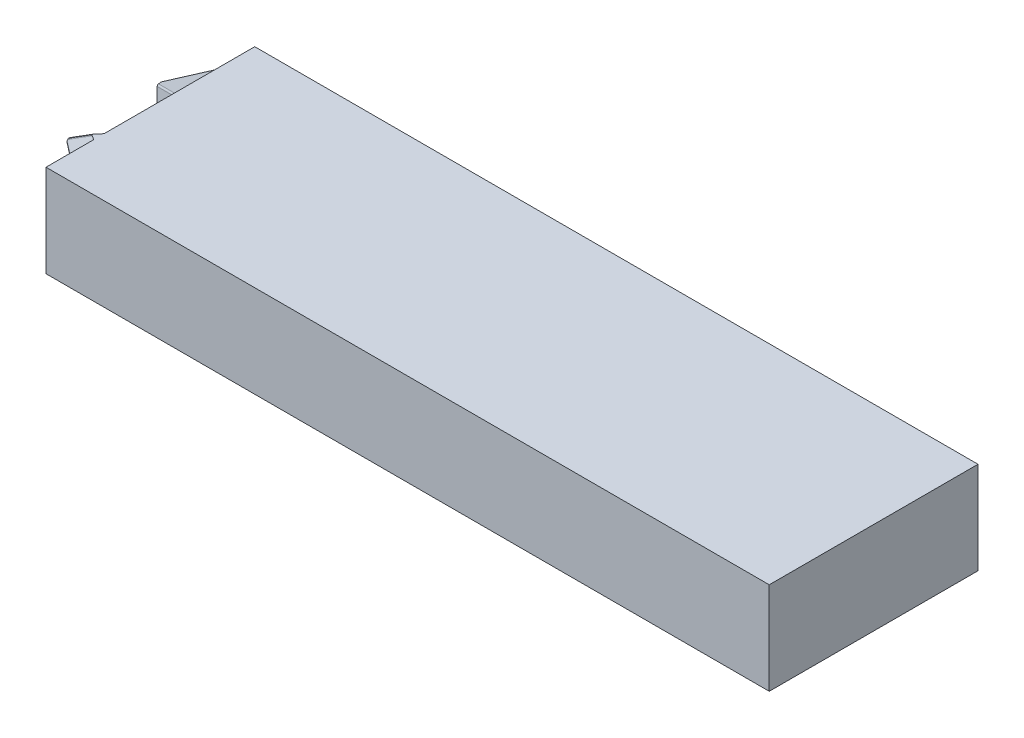
ISO-10303-21;
HEADER;
FILE_DESCRIPTION(('STEP AP214'),'2;1');
FILE_NAME('part.step','',(''),(''),'','','');
FILE_SCHEMA(('AUTOMOTIVE_DESIGN { 1 0 10303 214 1 1 1 1 }'));
ENDSEC;
DATA;
#1=APPLICATION_CONTEXT('core data for automotive mechanical design processes');
#2=APPLICATION_PROTOCOL_DEFINITION('international standard','automotive_design',2000,#1);
#3=PRODUCT_CONTEXT('',#1,'mechanical');
#4=PRODUCT('Part','Part','',(#3));
#5=PRODUCT_RELATED_PRODUCT_CATEGORY('part','',(#4));
#6=PRODUCT_DEFINITION_FORMATION('','',#4);
#7=PRODUCT_DEFINITION_CONTEXT('part definition',#1,'design');
#8=PRODUCT_DEFINITION('design','',#6,#7);
#9=PRODUCT_DEFINITION_SHAPE('','',#8);
#10=(LENGTH_UNIT() NAMED_UNIT(*) SI_UNIT(.MILLI.,.METRE.));
#11=(NAMED_UNIT(*) PLANE_ANGLE_UNIT() SI_UNIT($,.RADIAN.));
#12=(NAMED_UNIT(*) SI_UNIT($,.STERADIAN.) SOLID_ANGLE_UNIT());
#13=UNCERTAINTY_MEASURE_WITH_UNIT(LENGTH_MEASURE(1.E-05),#10,'distance_accuracy_value','');
#14=(GEOMETRIC_REPRESENTATION_CONTEXT(3) GLOBAL_UNCERTAINTY_ASSIGNED_CONTEXT((#13)) GLOBAL_UNIT_ASSIGNED_CONTEXT((#10,
#11,#12)) REPRESENTATION_CONTEXT('',''));
#15=CARTESIAN_POINT('',(0.,0.,0.));
#16=DIRECTION('',(0.,0.,1.));
#17=DIRECTION('',(1.,0.,0.));
#18=AXIS2_PLACEMENT_3D('',#15,#16,#17);
#19=CARTESIAN_POINT('',(-11.,2.8067,-3.175));
#20=DIRECTION('',(1.,0.,0.));
#21=DIRECTION('',(0.,0.,-1.));
#22=AXIS2_PLACEMENT_3D('',#19,#20,#21);
#23=PLANE('',#22);
#24=DIRECTION('',(0.,-0.87607248437468,0.482179429384514));
#25=VECTOR('',#24,1.);
#26=CARTESIAN_POINT('',(-11.,2.2745196464413,2.01462656238576));
#27=LINE('',#26,#25);
#28=CARTESIAN_POINT('',(-11.,2.8067,1.72172109647361));
#29=VERTEX_POINT('',#28);
#30=CARTESIAN_POINT('',(-11.,1.86321507108885,2.24100349920765));
#31=VERTEX_POINT('',#30);
#32=EDGE_CURVE('E237',#29,#31,#27,.T.);
#33=ORIENTED_EDGE('',*,*,#32,.T.);
#34=CARTESIAN_POINT('',(-11.,1.84729757885279,2.18563022142526));
#35=DIRECTION('',(1.,0.,0.));
#36=DIRECTION('',(0.,0.292680628640583,-0.956210253876496));
#37=AXIS2_PLACEMENT_3D('',#34,#35,#36);
#38=ELLIPSE('',#37,0.062410100244307,0.049609375);
#39=CARTESIAN_POINT('',(-11.,1.8031131352836,2.2226072602187));
#40=VERTEX_POINT('',#39);
#41=EDGE_CURVE('E229',#31,#40,#38,.T.);
#42=ORIENTED_EDGE('',*,*,#41,.T.);
#43=DIRECTION('',(0.,-0.456090790910399,-0.889933250556876));
#44=VECTOR('',#43,1.);
#45=CARTESIAN_POINT('',(-11.,0.0120613961511823,-1.27212784052748));
#46=LINE('',#45,#44);
#47=CARTESIAN_POINT('',(-11.,0.,-1.29566227204198));
#48=VERTEX_POINT('',#47);
#49=EDGE_CURVE('E193',#40,#48,#46,.T.);
#50=ORIENTED_EDGE('',*,*,#49,.T.);
#51=DIRECTION('',(0.,0.,1.));
#52=VECTOR('',#51,1.);
#53=CARTESIAN_POINT('',(-11.,0.,-3.175));
#54=LINE('',#53,#52);
#55=CARTESIAN_POINT('',(-11.,0.,3.175));
#56=VERTEX_POINT('',#55);
#57=EDGE_CURVE('E393',#48,#56,#54,.T.);
#58=ORIENTED_EDGE('',*,*,#57,.T.);
#59=DIRECTION('',(0.,-1.,0.));
#60=VECTOR('',#59,1.);
#61=CARTESIAN_POINT('',(-11.,2.8067,3.175));
#62=LINE('',#61,#60);
#63=CARTESIAN_POINT('',(-11.,2.8067,3.175));
#64=VERTEX_POINT('',#63);
#65=EDGE_CURVE('E400',#64,#56,#62,.T.);
#66=ORIENTED_EDGE('',*,*,#65,.F.);
#67=DIRECTION('',(0.,0.,1.));
#68=VECTOR('',#67,1.);
#69=CARTESIAN_POINT('',(-11.,2.8067,-3.175));
#70=LINE('',#69,#68);
#71=EDGE_CURVE('E382',#29,#64,#70,.T.);
#72=ORIENTED_EDGE('',*,*,#71,.F.);
#73=EDGE_LOOP('',(#33,#42,#50,#58,#66,#72));
#74=FACE_BOUND('',#73,.T.);
#75=ADVANCED_FACE('F39',(#74),#23,.F.);
#76=DIRECTION('',(0.,-1.,0.));
#77=VECTOR('',#76,1.);
#78=CARTESIAN_POINT('',(-11.,0.912218846153847,-0.692687520153666));
#79=LINE('',#78,#77);
#80=CARTESIAN_POINT('',(-11.,2.75866154006839,-0.692687520153666));
#81=VERTEX_POINT('',#80);
#82=CARTESIAN_POINT('',(-11.,1.80145727445214,-0.692687520153666));
#83=VERTEX_POINT('',#82);
#84=EDGE_CURVE('E409',#81,#83,#79,.T.);
#85=ORIENTED_EDGE('',*,*,#84,.T.);
#86=CARTESIAN_POINT('',(-11.,1.82172140136658,-0.636501427795264));
#87=DIRECTION('',(1.,0.,0.));
#88=DIRECTION('',(0.,-0.853282189545148,-0.521449427082855));
#89=AXIS2_PLACEMENT_3D('',#86,#87,#88);
#90=ELLIPSE('',#89,0.0708518275062262,0.049609375);
#91=CARTESIAN_POINT('',(-11.,1.76247801772125,-0.62890318402688));
#92=VERTEX_POINT('',#91);
#93=EDGE_CURVE('E224',#83,#92,#90,.F.);
#94=ORIENTED_EDGE('',*,*,#93,.T.);
#95=DIRECTION('',(0.,0.456180989989925,0.889887017756643));
#96=VECTOR('',#95,1.);
#97=CARTESIAN_POINT('',(-11.,2.7107906973169,1.22100104447861));
#98=LINE('',#97,#96);
#99=CARTESIAN_POINT('',(-11.,2.8067,1.40809442454617));
#100=VERTEX_POINT('',#99);
#101=EDGE_CURVE('E411',#92,#100,#98,.T.);
#102=ORIENTED_EDGE('',*,*,#101,.T.);
#103=CARTESIAN_POINT('',(-11.,2.8067,-3.175));
#104=VERTEX_POINT('',#103);
#105=EDGE_CURVE('E383',#104,#100,#70,.T.);
#106=ORIENTED_EDGE('',*,*,#105,.F.);
#107=DIRECTION('',(0.,-1.,0.));
#108=VECTOR('',#107,1.);
#109=CARTESIAN_POINT('',(-11.,2.8067,-3.175));
#110=LINE('',#109,#108);
#111=CARTESIAN_POINT('',(-11.,0.,-3.175));
#112=VERTEX_POINT('',#111);
#113=EDGE_CURVE('E403',#104,#112,#110,.T.);
#114=ORIENTED_EDGE('',*,*,#113,.T.);
#115=CARTESIAN_POINT('',(-11.,0.,-1.99962017215403));
#116=VERTEX_POINT('',#115);
#117=EDGE_CURVE('E394',#112,#116,#54,.T.);
#118=ORIENTED_EDGE('',*,*,#117,.T.);
#119=DIRECTION('',(0.,1.,0.));
#120=VECTOR('',#119,1.);
#121=CARTESIAN_POINT('',(-11.,2.30284384615385,-1.99962017215403));
#122=LINE('',#121,#120);
#123=CARTESIAN_POINT('',(-11.,2.75866154006839,-1.99962017215403));
#124=VERTEX_POINT('',#123);
#125=EDGE_CURVE('E415',#116,#124,#122,.T.);
#126=ORIENTED_EDGE('',*,*,#125,.T.);
#127=CARTESIAN_POINT('',(-11.,2.74627792594947,-1.94343407979562));
#128=DIRECTION('',(1.,0.,0.));
#129=DIRECTION('',(0.,-0.707106781186548,0.707106781186547));
#130=AXIS2_PLACEMENT_3D('',#127,#128,#129);
#131=ELLIPSE('',#130,0.0620698305227514,0.049609375);
#132=CARTESIAN_POINT('',(-11.,2.80246401830787,-1.95581769391454));
#133=VERTEX_POINT('',#132);
#134=EDGE_CURVE('E197',#124,#133,#131,.T.);
#135=ORIENTED_EDGE('',*,*,#134,.T.);
#136=DIRECTION('',(0.,0.,1.));
#137=VECTOR('',#136,1.);
#138=CARTESIAN_POINT('',(-11.,2.80246401830787,-1.19230769230769));
#139=LINE('',#138,#137);
#140=CARTESIAN_POINT('',(-11.,2.80246401830787,-0.736489998393152));
#141=VERTEX_POINT('',#140);
#142=EDGE_CURVE('E413',#133,#141,#139,.T.);
#143=ORIENTED_EDGE('',*,*,#142,.T.);
#144=CARTESIAN_POINT('',(-11.,2.74627792594947,-0.748873612512068));
#145=DIRECTION('',(1.,0.,0.));
#146=DIRECTION('',(0.,0.707106781186548,0.707106781186547));
#147=AXIS2_PLACEMENT_3D('',#144,#145,#146);
#148=ELLIPSE('',#147,0.0620698305227514,0.049609375);
#149=EDGE_CURVE('E53',#141,#81,#148,.T.);
#150=ORIENTED_EDGE('',*,*,#149,.T.);
#151=EDGE_LOOP('',(#85,#94,#102,#106,#114,#118,#126,#135,#143,#150));
#152=FACE_BOUND('',#151,.T.);
#153=ADVANCED_FACE('F316',(#152),#23,.F.);
#154=CARTESIAN_POINT('',(11.,2.8067,-3.175));
#155=DIRECTION('',(-1.,0.,0.));
#156=DIRECTION('',(0.,0.,1.));
#157=AXIS2_PLACEMENT_3D('',#154,#155,#156);
#158=PLANE('',#157);
#159=DIRECTION('',(0.,0.,-1.));
#160=VECTOR('',#159,1.);
#161=CARTESIAN_POINT('',(11.,0.,-3.175));
#162=LINE('',#161,#160);
#163=CARTESIAN_POINT('',(11.,0.,3.175));
#164=VERTEX_POINT('',#163);
#165=CARTESIAN_POINT('',(11.,0.,-3.175));
#166=VERTEX_POINT('',#165);
#167=EDGE_CURVE('E181',#164,#166,#162,.T.);
#168=ORIENTED_EDGE('',*,*,#167,.T.);
#169=DIRECTION('',(0.,-1.,0.));
#170=VECTOR('',#169,1.);
#171=CARTESIAN_POINT('',(11.,2.8067,-3.175));
#172=LINE('',#171,#170);
#173=CARTESIAN_POINT('',(11.,2.8067,-3.175));
#174=VERTEX_POINT('',#173);
#175=EDGE_CURVE('E406',#174,#166,#172,.T.);
#176=ORIENTED_EDGE('',*,*,#175,.F.);
#177=DIRECTION('',(0.,0.,-1.));
#178=VECTOR('',#177,1.);
#179=CARTESIAN_POINT('',(11.,2.8067,-3.175));
#180=LINE('',#179,#178);
#181=CARTESIAN_POINT('',(11.,2.8067,3.175));
#182=VERTEX_POINT('',#181);
#183=EDGE_CURVE('E376',#182,#174,#180,.T.);
#184=ORIENTED_EDGE('',*,*,#183,.F.);
#185=DIRECTION('',(0.,-1.,0.));
#186=VECTOR('',#185,1.);
#187=CARTESIAN_POINT('',(11.,2.8067,3.175));
#188=LINE('',#187,#186);
#189=EDGE_CURVE('E388',#182,#164,#188,.T.);
#190=ORIENTED_EDGE('',*,*,#189,.T.);
#191=EDGE_LOOP('',(#168,#176,#184,#190));
#192=FACE_BOUND('',#191,.T.);
#193=ADVANCED_FACE('F321',(#192),#158,.F.);
#194=CARTESIAN_POINT('',(11.,2.8067,-3.175));
#195=DIRECTION('',(0.,0.,1.));
#196=DIRECTION('',(1.,0.,0.));
#197=AXIS2_PLACEMENT_3D('',#194,#195,#196);
#198=PLANE('',#197);
#199=DIRECTION('',(-1.,0.,0.));
#200=VECTOR('',#199,1.);
#201=CARTESIAN_POINT('',(11.,0.,-3.175));
#202=LINE('',#201,#200);
#203=EDGE_CURVE('E391',#166,#112,#202,.T.);
#204=ORIENTED_EDGE('',*,*,#203,.T.);
#205=ORIENTED_EDGE('',*,*,#113,.F.);
#206=DIRECTION('',(-1.,0.,0.));
#207=VECTOR('',#206,1.);
#208=CARTESIAN_POINT('',(11.,2.8067,-3.175));
#209=LINE('',#208,#207);
#210=EDGE_CURVE('E379',#174,#104,#209,.T.);
#211=ORIENTED_EDGE('',*,*,#210,.F.);
#212=ORIENTED_EDGE('',*,*,#175,.T.);
#213=EDGE_LOOP('',(#204,#205,#211,#212));
#214=FACE_BOUND('',#213,.T.);
#215=ADVANCED_FACE('F325',(#214),#198,.F.);
#216=CARTESIAN_POINT('',(11.,2.8067,3.175));
#217=DIRECTION('',(0.,0.,-1.));
#218=DIRECTION('',(-1.,0.,0.));
#219=AXIS2_PLACEMENT_3D('',#216,#217,#218);
#220=PLANE('',#219);
#221=DIRECTION('',(1.,0.,0.));
#222=VECTOR('',#221,1.);
#223=CARTESIAN_POINT('',(11.,0.,3.175));
#224=LINE('',#223,#222);
#225=EDGE_CURVE('E380',#56,#164,#224,.T.);
#226=ORIENTED_EDGE('',*,*,#225,.T.);
#227=ORIENTED_EDGE('',*,*,#189,.F.);
#228=DIRECTION('',(1.,0.,0.));
#229=VECTOR('',#228,1.);
#230=CARTESIAN_POINT('',(11.,2.8067,3.175));
#231=LINE('',#230,#229);
#232=EDGE_CURVE('E386',#64,#182,#231,.T.);
#233=ORIENTED_EDGE('',*,*,#232,.F.);
#234=ORIENTED_EDGE('',*,*,#65,.T.);
#235=EDGE_LOOP('',(#226,#227,#233,#234));
#236=FACE_BOUND('',#235,.T.);
#237=ADVANCED_FACE('F324',(#236),#220,.F.);
#238=CARTESIAN_POINT('',(0.,2.8067,0.));
#239=DIRECTION('',(0.,-1.,0.));
#240=DIRECTION('',(0.,0.,-1.));
#241=AXIS2_PLACEMENT_3D('',#238,#239,#240);
#242=PLANE('',#241);
#243=DIRECTION('',(-0.651145165888793,0.,0.758953208662863));
#244=VECTOR('',#243,1.);
#245=CARTESIAN_POINT('',(-5.64024533094836,2.8067,-4.83905784935588));
#246=LINE('',#245,#244);
#247=CARTESIAN_POINT('',(-11.149563435863,2.8067,1.58242060477962));
#248=VERTEX_POINT('',#247);
#249=EDGE_CURVE('E422',#100,#248,#246,.T.);
#250=ORIENTED_EDGE('',*,*,#249,.T.);
#251=CARTESIAN_POINT('',(-11.071270536977,2.8067,1.61433122777363));
#252=DIRECTION('',(0.,-1.,0.));
#253=DIRECTION('',(0.977280791027944,0.,0.211948709568604));
#254=AXIS2_PLACEMENT_3D('',#251,#252,#253);
#255=ELLIPSE('',#254,0.0871317741458214,0.049609375);
#256=CARTESIAN_POINT('',(-11.1243635835041,2.8067,1.64624185076764));
#257=VERTEX_POINT('',#256);
#258=EDGE_CURVE('E218',#248,#257,#255,.F.);
#259=ORIENTED_EDGE('',*,*,#258,.T.);
#260=DIRECTION('',(0.854870495857655,0.,0.518841435616015));
#261=VECTOR('',#260,1.);
#262=CARTESIAN_POINT('',(-3.72481681218898,2.8067,6.13720450340346));
#263=LINE('',#262,#261);
#264=EDGE_CURVE('E420',#257,#29,#263,.T.);
#265=ORIENTED_EDGE('',*,*,#264,.T.);
#266=ORIENTED_EDGE('',*,*,#71,.T.);
#267=ORIENTED_EDGE('',*,*,#232,.T.);
#268=ORIENTED_EDGE('',*,*,#183,.T.);
#269=ORIENTED_EDGE('',*,*,#210,.T.);
#270=ORIENTED_EDGE('',*,*,#105,.T.);
#271=EDGE_LOOP('',(#250,#259,#265,#266,#267,#268,#269,#270));
#272=FACE_BOUND('',#271,.T.);
#273=ADVANCED_FACE('F270',(#272),#242,.F.);
#274=CARTESIAN_POINT('',(0.,0.,0.));
#275=DIRECTION('',(0.,-1.,0.));
#276=DIRECTION('',(0.,0.,-1.));
#277=AXIS2_PLACEMENT_3D('',#274,#275,#276);
#278=PLANE('',#277);
#279=DIRECTION('',(-0.651070996045853,0.,-0.759016836511458));
#280=VECTOR('',#279,1.);
#281=CARTESIAN_POINT('',(-11.5766568640276,0.,-1.96792731125442));
#282=LINE('',#281,#280);
#283=CARTESIAN_POINT('',(-11.3771281063133,0.,-1.73531721589903));
#284=VERTEX_POINT('',#283);
#285=EDGE_CURVE('E246',#48,#284,#282,.T.);
#286=ORIENTED_EDGE('',*,*,#285,.T.);
#287=CARTESIAN_POINT('',(-11.3090304137424,0.,-1.77911969413852));
#288=DIRECTION('',(0.,-1.,0.));
#289=DIRECTION('',(-0.882947592858924,0.,0.469471562785897));
#290=AXIS2_PLACEMENT_3D('',#287,#288,#289);
#291=ELLIPSE('',#290,0.081438040258606,0.049609375);
#292=CARTESIAN_POINT('',(-11.3323206045525,0.,-1.822922172378));
#293=VERTEX_POINT('',#292);
#294=EDGE_CURVE('E226',#284,#293,#291,.T.);
#295=ORIENTED_EDGE('',*,*,#294,.T.);
#296=DIRECTION('',(0.882947592858924,0.,-0.469471562785897));
#297=VECTOR('',#296,1.);
#298=CARTESIAN_POINT('',(-12.0819380176308,0.,-1.42434352370659));
#299=LINE('',#298,#297);
#300=EDGE_CURVE('E192',#293,#116,#299,.T.);
#301=ORIENTED_EDGE('',*,*,#300,.T.);
#302=ORIENTED_EDGE('',*,*,#117,.F.);
#303=ORIENTED_EDGE('',*,*,#203,.F.);
#304=ORIENTED_EDGE('',*,*,#167,.F.);
#305=ORIENTED_EDGE('',*,*,#225,.F.);
#306=ORIENTED_EDGE('',*,*,#57,.F.);
#307=EDGE_LOOP('',(#286,#295,#301,#302,#303,#304,#305,#306));
#308=FACE_BOUND('',#307,.T.);
#309=ADVANCED_FACE('F367',(#308),#278,.T.);
#310=CARTESIAN_POINT('',(-12.0819380176308,1.99713308035468,1.51064251977768));
#311=DIRECTION('',(0.469471562785897,-0.425739166501146,-0.773526091248561));
#312=DIRECTION('',(0.,0.87607248437468,-0.482179429384514));
#313=AXIS2_PLACEMENT_3D('',#310,#311,#312);
#314=PLANE('',#313);
#315=DIRECTION('',(0.803410896396009,0.569360322182526,0.174240509286364));
#316=VECTOR('',#315,1.);
#317=CARTESIAN_POINT('',(-12.1317507958088,2.09278597377346,1.42776378218787));
#318=LINE('',#317,#316);
#319=CARTESIAN_POINT('',(-12.0722490634188,2.13495359394886,1.44066827751096));
#320=VERTEX_POINT('',#319);
#321=EDGE_CURVE('E208',#257,#320,#318,.F.);
#322=ORIENTED_EDGE('',*,*,#321,.T.);
#323=CARTESIAN_POINT('',(-18.260598763273,-2.10240745888857,0.0170011842921174));
#324=DIRECTION('',(0.469471562785897,-0.425739166501146,-0.773526091248561));
#325=DIRECTION('',(-0.22089112034542,-0.90484593280122,0.363951852372859));
#326=AXIS2_PLACEMENT_3D('',#323,#324,#325);
#327=ELLIPSE('',#326,14.9152356645648,6.35);
#328=CARTESIAN_POINT('',(-12.0757559167848,2.10354509068977,1.45582673460892));
#329=VERTEX_POINT('',#328);
#330=EDGE_CURVE('E252',#320,#329,#327,.T.);
#331=ORIENTED_EDGE('',*,*,#330,.T.);
#332=DIRECTION('',(-0.794893371518424,0.177583721899131,-0.580179756310512));
#333=VECTOR('',#332,1.);
#334=CARTESIAN_POINT('',(-12.0393609775663,2.09541425327648,1.48239080939345));
#335=LINE('',#334,#333);
#336=EDGE_CURVE('E211',#329,#31,#335,.F.);
#337=ORIENTED_EDGE('',*,*,#336,.T.);
#338=ORIENTED_EDGE('',*,*,#32,.F.);
#339=ORIENTED_EDGE('',*,*,#264,.F.);
#340=EDGE_LOOP('',(#322,#331,#337,#338,#339));
#341=FACE_BOUND('',#340,.T.);
#342=ADVANCED_FACE('F362',(#341),#314,.F.);
#343=CARTESIAN_POINT('',(-12.0819380176308,2.19885947624498,1.48343131548544));
#344=DIRECTION('',(0.469471562785896,-0.785723600244635,0.402783907019605));
#345=DIRECTION('',(0.,-0.456180989989925,-0.889887017756643));
#346=AXIS2_PLACEMENT_3D('',#343,#344,#345);
#347=PLANE('',#346);
#348=DIRECTION('',(0.700184832856153,0.609210737355738,0.372294879535939));
#349=VECTOR('',#348,1.);
#350=CARTESIAN_POINT('',(-12.1075345037534,0.798844017072797,-1.2177897255631));
#351=LINE('',#350,#349);
#352=CARTESIAN_POINT('',(-12.0230771623647,0.872327927046444,-1.17288296057368));
#353=VERTEX_POINT('',#352);
#354=EDGE_CURVE('E213',#92,#353,#351,.F.);
#355=ORIENTED_EDGE('',*,*,#354,.T.);
#356=CARTESIAN_POINT('',(-18.260598763273,-2.24463690429748,0.0170011842921174));
#357=DIRECTION('',(0.469471562785896,-0.785723600244635,0.402783907019605));
#358=DIRECTION('',(-0.596327447527803,-0.618577742905942,-0.511620124024033));
#359=AXIS2_PLACEMENT_3D('',#356,#357,#358);
#360=ELLIPSE('',#359,8.08172237415668,6.35);
#361=CARTESIAN_POINT('',(-12.0597122264441,2.16169678811444,1.38503121224262));
#362=VERTEX_POINT('',#361);
#363=EDGE_CURVE('E443',#353,#362,#360,.T.);
#364=ORIENTED_EDGE('',*,*,#363,.T.);
#365=DIRECTION('',(0.803410896396009,0.569360322182526,0.174240509286364));
#366=VECTOR('',#365,1.);
#367=CARTESIAN_POINT('',(-12.0432842400164,2.17333895489016,1.38859404756705));
#368=LINE('',#367,#366);
#369=EDGE_CURVE('E216',#362,#248,#368,.T.);
#370=ORIENTED_EDGE('',*,*,#369,.T.);
#371=ORIENTED_EDGE('',*,*,#249,.F.);
#372=ORIENTED_EDGE('',*,*,#101,.F.);
#373=EDGE_LOOP('',(#355,#364,#370,#371,#372));
#374=FACE_BOUND('',#373,.T.);
#375=ADVANCED_FACE('F356',(#374),#347,.F.);
#376=CARTESIAN_POINT('',(-12.0819380176308,0.524019213873469,-1.53450622211015));
#377=DIRECTION('',(0.469471562785897,0.785764421384311,-0.402704265959459));
#378=DIRECTION('',(0.,0.456090790910398,0.889933250556876));
#379=AXIS2_PLACEMENT_3D('',#376,#377,#378);
#380=PLANE('',#379);
#381=DIRECTION('',(-0.794893371518424,0.177583721899131,-0.580179756310512));
#382=VECTOR('',#381,1.);
#383=CARTESIAN_POINT('',(-13.2357809139477,2.30259936862763,0.590747098471428));
#384=LINE('',#383,#382);
#385=CARTESIAN_POINT('',(-12.0721154986172,2.0426298646614,1.4400875776904));
#386=VERTEX_POINT('',#385);
#387=EDGE_CURVE('E200',#40,#386,#384,.T.);
#388=ORIENTED_EDGE('',*,*,#387,.T.);
#389=CARTESIAN_POINT('',(-18.260598763273,5.01073822463675,0.0170011842921174));
#390=DIRECTION('',(0.469471562785897,0.785764421384311,-0.402704265959459));
#391=DIRECTION('',(0.596408425362376,-0.618525887967981,-0.511588424488077));
#392=AXIS2_PLACEMENT_3D('',#389,#390,#391);
#393=ELLIPSE('',#392,8.08130252170615,6.35);
#394=CARTESIAN_POINT('',(-12.0639559116625,0.597521111537213,-1.37012439386751));
#395=VERTEX_POINT('',#394);
#396=EDGE_CURVE('E253',#386,#395,#393,.T.);
#397=ORIENTED_EDGE('',*,*,#396,.T.);
#398=DIRECTION('',(-0.700214429036765,0.609167102283721,0.372310616104311));
#399=VECTOR('',#398,1.);
#400=CARTESIAN_POINT('',(-11.9985665918809,0.540634219751169,-1.4048925119253));
#401=LINE('',#400,#399);
#402=EDGE_CURVE('E198',#395,#284,#401,.F.);
#403=ORIENTED_EDGE('',*,*,#402,.T.);
#404=ORIENTED_EDGE('',*,*,#285,.F.);
#405=ORIENTED_EDGE('',*,*,#49,.F.);
#406=EDGE_LOOP('',(#388,#397,#403,#404,#405));
#407=FACE_BOUND('',#406,.T.);
#408=ADVANCED_FACE('F243',(#407),#380,.F.);
#409=CARTESIAN_POINT('',(-12.0819380176308,0.912218846153847,-1.2679641686011));
#410=DIRECTION('',(0.469471562785897,0.,-0.882947592858924));
#411=DIRECTION('',(0.,1.,0.));
#412=AXIS2_PLACEMENT_3D('',#409,#410,#411);
#413=PLANE('',#412);
#414=DIRECTION('',(0.799251014255886,0.424969302544865,0.424969302544865));
#415=VECTOR('',#414,1.);
#416=CARTESIAN_POINT('',(-12.5136986488363,1.95381369178885,-1.4975353684332));
#417=LINE('',#416,#415);
#418=CARTESIAN_POINT('',(-12.0370884748072,2.20723181654596,-1.2441172436761));
#419=VERTEX_POINT('',#418);
#420=EDGE_CURVE('E220',#81,#419,#417,.F.);
#421=ORIENTED_EDGE('',*,*,#420,.T.);
#422=DIRECTION('',(0.,-1.,0.));
#423=VECTOR('',#422,1.);
#424=CARTESIAN_POINT('',(-12.0370884748072,2.8067,-1.2441172436761));
#425=LINE('',#424,#423);
#426=CARTESIAN_POINT('',(-12.0370884748072,0.899116342753824,-1.2441172436761));
#427=VERTEX_POINT('',#426);
#428=EDGE_CURVE('E298',#419,#427,#425,.T.);
#429=ORIENTED_EDGE('',*,*,#428,.T.);
#430=DIRECTION('',(0.700184832856153,0.609210737355738,0.372294879535939));
#431=VECTOR('',#430,1.);
#432=CARTESIAN_POINT('',(-11.0305745037534,1.77485527580566,-0.708944272167742));
#433=LINE('',#432,#431);
#434=EDGE_CURVE('E60',#427,#83,#433,.T.);
#435=ORIENTED_EDGE('',*,*,#434,.T.);
#436=ORIENTED_EDGE('',*,*,#84,.F.);
#437=EDGE_LOOP('',(#421,#429,#435,#436));
#438=FACE_BOUND('',#437,.T.);
#439=ADVANCED_FACE('F345',(#438),#413,.F.);
#440=CARTESIAN_POINT('',(-12.0819380176308,2.30284384615385,-1.42434352370659));
#441=DIRECTION('',(0.469471562785897,0.,0.882947592858924));
#442=DIRECTION('',(0.,-1.,0.));
#443=AXIS2_PLACEMENT_3D('',#440,#441,#442);
#444=PLANE('',#443);
#445=DIRECTION('',(0.,-1.,0.));
#446=VECTOR('',#445,1.);
#447=CARTESIAN_POINT('',(-12.07696,2.30284384615385,-1.42699038263188));
#448=LINE('',#447,#446);
#449=CARTESIAN_POINT('',(-12.07696,2.18603175054624,-1.42699038263188));
#450=VERTEX_POINT('',#449);
#451=CARTESIAN_POINT('',(-12.07696,0.64781558899754,-1.42699038263188));
#452=VERTEX_POINT('',#451);
#453=EDGE_CURVE('E173',#450,#452,#448,.T.);
#454=ORIENTED_EDGE('',*,*,#453,.F.);
#455=DIRECTION('',(-0.799251014255886,-0.424969302544865,0.424969302544865));
#456=VECTOR('',#455,1.);
#457=CARTESIAN_POINT('',(-12.0413629300597,2.20495904837302,-1.44591768045866));
#458=LINE('',#457,#456);
#459=EDGE_CURVE('E187',#450,#124,#458,.F.);
#460=ORIENTED_EDGE('',*,*,#459,.T.);
#461=ORIENTED_EDGE('',*,*,#125,.F.);
#462=ORIENTED_EDGE('',*,*,#300,.F.);
#463=DIRECTION('',(-0.700214429036765,0.609167102283721,0.372310616104311));
#464=VECTOR('',#463,1.);
#465=CARTESIAN_POINT('',(-12.7860390744291,1.26469468652512,-1.04996635096414));
#466=LINE('',#465,#464);
#467=EDGE_CURVE('E191',#293,#452,#466,.T.);
#468=ORIENTED_EDGE('',*,*,#467,.T.);
#469=EDGE_LOOP('',(#454,#460,#461,#462,#468));
#470=FACE_BOUND('',#469,.T.);
#471=ADVANCED_FACE('F185',(#470),#444,.F.);
#472=CARTESIAN_POINT('',(-12.0819380176308,2.22718736986044,-1.19230769230769));
#473=DIRECTION('',(0.469471562785897,-0.882947592858924,0.));
#474=DIRECTION('',(0.,0.,-1.));
#475=AXIS2_PLACEMENT_3D('',#472,#473,#474);
#476=PLANE('',#475);
#477=DIRECTION('',(-0.799251014255886,-0.424969302544865,0.424969302544865));
#478=VECTOR('',#477,1.);
#479=CARTESIAN_POINT('',(-12.1458728211632,2.19319263181082,-1.34654630741749));
#480=LINE('',#479,#478);
#481=CARTESIAN_POINT('',(-12.0679764362204,2.23461087437727,-1.38796454998394));
#482=VERTEX_POINT('',#481);
#483=EDGE_CURVE('E202',#133,#482,#480,.T.);
#484=ORIENTED_EDGE('',*,*,#483,.T.);
#485=CARTESIAN_POINT('',(-18.260598763273,-1.0580648236341,0.0170011842921174));
#486=DIRECTION('',(0.469471562785897,-0.882947592858924,0.));
#487=DIRECTION('',(-0.882947592858924,-0.469471562785897,0.));
#488=AXIS2_PLACEMENT_3D('',#485,#486,#487);
#489=ELLIPSE('',#488,7.19181982187543,6.35);
#490=CARTESIAN_POINT('',(-12.0472637346254,2.24562401317053,-1.29333000353049));
#491=VERTEX_POINT('',#490);
#492=EDGE_CURVE('E176',#482,#491,#489,.T.);
#493=ORIENTED_EDGE('',*,*,#492,.T.);
#494=DIRECTION('',(0.799251014255886,0.424969302544865,0.424969302544865));
#495=VECTOR('',#494,1.);
#496=CARTESIAN_POINT('',(-12.0413629300597,2.2487615266125,-1.29019249008852));
#497=LINE('',#496,#495);
#498=EDGE_CURVE('E425',#491,#141,#497,.T.);
#499=ORIENTED_EDGE('',*,*,#498,.T.);
#500=ORIENTED_EDGE('',*,*,#142,.F.);
#501=EDGE_LOOP('',(#484,#493,#499,#500));
#502=FACE_BOUND('',#501,.T.);
#503=ADVANCED_FACE('F333',(#502),#476,.F.);
#504=CARTESIAN_POINT('',(-12.1225826303532,2.14939015357133,-1.34654630741749));
#505=DIRECTION('',(-0.799251014255886,-0.424969302544865,0.424969302544865));
#506=DIRECTION('',(0.469471562785897,-0.882947592858924,0.));
#507=AXIS2_PLACEMENT_3D('',#504,#505,#506);
#508=CYLINDRICAL_SURFACE('',#507,0.049609375);
#509=CARTESIAN_POINT('',(-12.0679764362204,2.23461087437727,-1.38796454998393));
#510=CARTESIAN_POINT('',(-12.0685178935601,2.23432651005764,-1.39035135187132));
#511=CARTESIAN_POINT('',(-12.0690557371026,2.2338364982014,-1.39271535927891));
#512=CARTESIAN_POINT('',(-12.0701078045915,2.23246082009783,-1.39732802221642));
#513=CARTESIAN_POINT('',(-12.0706220511985,2.23157554258714,-1.39957678866727));
#514=CARTESIAN_POINT('',(-12.0716124087445,2.22942272417704,-1.40389743223072));
#515=CARTESIAN_POINT('',(-12.0720884606181,2.22815460513311,-1.40596903568762));
#516=CARTESIAN_POINT('',(-12.0729869892176,2.22527728424333,-1.4098711076117));
#517=CARTESIAN_POINT('',(-12.0734094886831,2.22366822794757,-1.41170167843951));
#518=CARTESIAN_POINT('',(-12.0741871975154,2.22017464840887,-1.41506547248281));
#519=CARTESIAN_POINT('',(-12.0745428658623,2.21829217435799,-1.41660072573746));
#520=CARTESIAN_POINT('',(-12.0751836543922,2.21430232299135,-1.41936295782941));
#521=CARTESIAN_POINT('',(-12.0754687385449,2.21219483159605,-1.42058977923015));
#522=CARTESIAN_POINT('',(-12.0759803616759,2.20767650919502,-1.42278927872854));
#523=CARTESIAN_POINT('',(-12.0762020445036,2.20525491822872,-1.42374091946249));
#524=CARTESIAN_POINT('',(-12.0765605666216,2.20029419445692,-1.42527903983004));
#525=CARTESIAN_POINT('',(-12.0766973959963,2.19775504795148,-1.42586547678707));
#526=CARTESIAN_POINT('',(-12.0769052600174,2.19216112585096,-1.42675597363596));
#527=CARTESIAN_POINT('',(-12.0769603699582,2.18909460704324,-1.42699171328274));
#528=CARTESIAN_POINT('',(-12.07696,2.18603175054624,-1.42699038263188));
#529=B_SPLINE_CURVE_WITH_KNOTS('',3,(#509,#510,#511,#512,#513,#514,#515,#516,#517,#518,#519,
#520,#521,#522,#523,#524,#525,#526,#527,#528),.UNSPECIFIED.,.F.,.F.,(4,2,2,2,2,2,2,2,2,4),(0.,
0.00738486332842187,0.0147624797201715,0.0221512935584562,0.0295369593586835,0.0368698833632013,
0.044206542834676,0.0520082282526358,0.0598108251798284,0.0689939565499604),.UNSPECIFIED.);
#530=EDGE_CURVE('E170',#482,#450,#529,.T.);
#531=ORIENTED_EDGE('',*,*,#530,.F.);
#532=ORIENTED_EDGE('',*,*,#483,.F.);
#533=ORIENTED_EDGE('',*,*,#134,.F.);
#534=ORIENTED_EDGE('',*,*,#459,.F.);
#535=EDGE_LOOP('',(#531,#532,#533,#534));
#536=FACE_BOUND('',#535,.T.);
#537=ADVANCED_FACE('F196',(#536),#508,.T.);
#538=CARTESIAN_POINT('',(-13.2124907231377,2.34158065046975,0.570769191527345));
#539=DIRECTION('',(-0.794893371518424,0.177583721899131,-0.580179756310512));
#540=DIRECTION('',(-0.589550246913567,0.,0.807731704444088));
#541=AXIS2_PLACEMENT_3D('',#538,#539,#540);
#542=CYLINDRICAL_SURFACE('',#541,0.049609375);
#543=CARTESIAN_POINT('',(-12.0721154986172,2.0426298646614,1.4400875776904));
#544=CARTESIAN_POINT('',(-12.0726071892281,2.04401592425513,1.44222585060078));
#545=CARTESIAN_POINT('',(-12.0730747818482,2.04558340181247,1.44425406955401));
#546=CARTESIAN_POINT('',(-12.073947406347,2.04904025852223,1.44803182185421));
#547=CARTESIAN_POINT('',(-12.0743524068722,2.0509297980119,1.44978121554558));
#548=CARTESIAN_POINT('',(-12.0750856826754,2.05499236800065,1.45294359223846));
#549=CARTESIAN_POINT('',(-12.0754138054793,2.05716594877568,1.45435590680144));
#550=CARTESIAN_POINT('',(-12.0759803624459,2.06172925968924,1.45679172564855));
#551=CARTESIAN_POINT('',(-12.076218875033,2.0641187985443,1.45781556991861));
#552=CARTESIAN_POINT('',(-12.0765940603577,2.06897877643151,1.45942501384768));
#553=CARTESIAN_POINT('',(-12.0767332247937,2.07144548502991,1.4600213376883));
#554=CARTESIAN_POINT('',(-12.0769171160642,2.07644679687043,1.46080915355597));
#555=CARTESIAN_POINT('',(-12.0769617977337,2.07898143199708,1.46100045197121));
#556=CARTESIAN_POINT('',(-12.0769580586325,2.08409185304508,1.46098443534845));
#557=CARTESIAN_POINT('',(-12.0769080446713,2.08666760719121,1.46077029914597));
#558=CARTESIAN_POINT('',(-12.0767168223911,2.09175027019447,1.459951056877));
#559=CARTESIAN_POINT('',(-12.0765756530809,2.09425720802247,1.4593461180494));
#560=CARTESIAN_POINT('',(-12.0762176246858,2.09904753857033,1.45781013945492));
#561=CARTESIAN_POINT('',(-12.0760041793975,2.10133589577794,1.45689380191924));
#562=CARTESIAN_POINT('',(-12.0757559167848,2.10354509068977,1.45582673460892));
#563=B_SPLINE_CURVE_WITH_KNOTS('',3,(#543,#544,#545,#546,#547,#548,#549,#550,#551,#552,#553,
#554,#555,#556,#557,#558,#559,#560,#561,#562),.UNSPECIFIED.,.F.,.F.,(4,2,2,2,2,2,2,2,2,4),(0.,
0.00777984040925617,0.0155635653548551,0.0233625997572745,0.0311547926794512,0.0387439444610599,
0.0463367232199395,0.0540583814956951,0.0617767375753529,0.0691721746272037),.UNSPECIFIED.);
#564=EDGE_CURVE('E249',#386,#329,#563,.T.);
#565=ORIENTED_EDGE('',*,*,#564,.F.);
#566=ORIENTED_EDGE('',*,*,#387,.F.);
#567=ORIENTED_EDGE('',*,*,#41,.F.);
#568=ORIENTED_EDGE('',*,*,#336,.F.);
#569=EDGE_LOOP('',(#565,#566,#567,#568));
#570=FACE_BOUND('',#569,.T.);
#571=ADVANCED_FACE('F248',(#570),#542,.T.);
#572=CARTESIAN_POINT('',(-12.0199940492063,2.13435969815928,1.40857590545435));
#573=DIRECTION('',(0.803410896396009,0.569360322182526,0.174240509286364));
#574=DIRECTION('',(-0.578205052435799,0.815891486251521,0.));
#575=AXIS2_PLACEMENT_3D('',#572,#573,#574);
#576=CYLINDRICAL_SURFACE('',#575,0.049609375);
#577=CARTESIAN_POINT('',(-12.0722490634188,2.13495359394886,1.44066827751096));
#578=CARTESIAN_POINT('',(-12.0719316375497,2.13781346407242,1.43928833445687));
#579=CARTESIAN_POINT('',(-12.0715656887548,2.14057583161904,1.4376956898484));
#580=CARTESIAN_POINT('',(-12.0707387274438,2.14581695857577,1.43408844707186));
#581=CARTESIAN_POINT('',(-12.070277161501,2.14829393009495,1.43207139131788));
#582=CARTESIAN_POINT('',(-12.0693450178783,2.1524790665513,1.4279868981166));
#583=CARTESIAN_POINT('',(-12.0688874510223,2.15424686160046,1.42597806091979));
#584=CARTESIAN_POINT('',(-12.0679167736138,2.15741531498578,1.4217056228901));
#585=CARTESIAN_POINT('',(-12.0674037921484,2.1588168016322,1.41944261367583));
#586=CARTESIAN_POINT('',(-12.0663289598456,2.16119055476793,1.41468769115001));
#587=CARTESIAN_POINT('',(-12.0657667717352,2.1621595275572,1.4121941902076));
#588=CARTESIAN_POINT('',(-12.0646146198669,2.1635857529224,1.4070685809295));
#589=CARTESIAN_POINT('',(-12.0640246564102,2.16404301104331,1.40443647409608));
#590=CARTESIAN_POINT('',(-12.0629130387042,2.16438743477995,1.39946180142031));
#591=CARTESIAN_POINT('',(-12.0623918773222,2.16433762066104,1.39712330031081));
#592=CARTESIAN_POINT('',(-12.0613628763007,2.16381930151759,1.39249382585482));
#593=CARTESIAN_POINT('',(-12.0608550147452,2.16335153661551,1.39020277581511));
#594=CARTESIAN_POINT('',(-12.0601417768482,2.16239668121006,1.38697717850895));
#595=CARTESIAN_POINT('',(-12.0599253098566,2.16206512961591,1.38599708340976));
#596=CARTESIAN_POINT('',(-12.0597122264441,2.16169678811444,1.38503121224262));
#597=B_SPLINE_CURVE_WITH_KNOTS('',3,(#577,#578,#579,#580,#581,#582,#583,#584,#585,#586,#587,
#588,#589,#590,#591,#592,#593,#594,#595,#596),.UNSPECIFIED.,.F.,.F.,(4,2,2,2,2,2,2,2,2,4),(0.,
0.00958002791935003,0.0192171365438587,0.0273275771456286,0.0354195162699066,0.0435720679278637,
0.0517245312429691,0.0588775050243794,0.0660178371083519,0.0691856186017881),.UNSPECIFIED.);
#598=EDGE_CURVE('E277',#320,#362,#597,.T.);
#599=ORIENTED_EDGE('',*,*,#598,.F.);
#600=ORIENTED_EDGE('',*,*,#321,.F.);
#601=ORIENTED_EDGE('',*,*,#258,.F.);
#602=ORIENTED_EDGE('',*,*,#369,.F.);
#603=EDGE_LOOP('',(#599,#600,#601,#602));
#604=FACE_BOUND('',#603,.T.);
#605=ADVANCED_FACE('F306',(#604),#576,.T.);
#606=CARTESIAN_POINT('',(-12.0829938458613,0.879439523169396,-1.21233947007106));
#607=DIRECTION('',(-0.700184832856153,-0.609210737355738,-0.372294879535939));
#608=DIRECTION('',(0.656396100069751,-0.754416436600649,0.));
#609=AXIS2_PLACEMENT_3D('',#606,#607,#608);
#610=CYLINDRICAL_SURFACE('',#609,0.049609375);
#611=ORIENTED_EDGE('',*,*,#434,.F.);
#612=CARTESIAN_POINT('',(-12.0370884748072,0.899116342753824,-1.2441172436761));
#613=CARTESIAN_POINT('',(-12.0370884273045,0.896699637718022,-1.24411682005811));
#614=CARTESIAN_POINT('',(-12.0370598507398,0.894271698032347,-1.24397596194276));
#615=CARTESIAN_POINT('',(-12.0369336732495,0.889436453106934,-1.24335316736443));
#616=CARTESIAN_POINT('',(-12.0368353239628,0.88702966059105,-1.24286753289384));
#617=CARTESIAN_POINT('',(-12.0365828909155,0.882770152265952,-1.24161977292407));
#618=CARTESIAN_POINT('',(-12.0364425012692,0.880897367744429,-1.24092550443595));
#619=CARTESIAN_POINT('',(-12.0361034416423,0.877298622943049,-1.2392466931601));
#620=CARTESIAN_POINT('',(-12.0359049987944,0.875572123649393,-1.23826328156851));
#621=CARTESIAN_POINT('',(-12.0354470829384,0.872315222257757,-1.23599039742338));
#622=CARTESIAN_POINT('',(-12.0351870420769,0.870786862818052,-1.23469807604937));
#623=CARTESIAN_POINT('',(-12.0346136555517,0.868018267988984,-1.2318428981393));
#624=CARTESIAN_POINT('',(-12.0343002993443,0.866778089706509,-1.23027998808944));
#625=CARTESIAN_POINT('',(-12.0336784200965,0.864774269869982,-1.22717131413157));
#626=CARTESIAN_POINT('',(-12.0333747991128,0.863969182878739,-1.22565092579761));
#627=CARTESIAN_POINT('',(-12.0327479418658,0.862613250861413,-1.22250546080054));
#628=CARTESIAN_POINT('',(-12.0324247010322,0.862062465331684,-1.2208803597401));
#629=CARTESIAN_POINT('',(-12.0316529438836,0.861051959606852,-1.21699198303101));
#630=CARTESIAN_POINT('',(-12.0312000882087,0.86069115826035,-1.21470397642084));
#631=CARTESIAN_POINT('',(-12.0302916781728,0.860349390675532,-1.21010075810363));
#632=CARTESIAN_POINT('',(-12.0298361201943,0.86036919928911,-1.20778550049091));
#633=CARTESIAN_POINT('',(-12.0287195926297,0.860809571245364,-1.20209433304827));
#634=CARTESIAN_POINT('',(-12.0280628920252,0.861414421228223,-1.19873225681533));
#635=CARTESIAN_POINT('',(-12.0267801563456,0.863140369231127,-1.1921377475366));
#636=CARTESIAN_POINT('',(-12.0261542182892,0.864262997388059,-1.18890572983426));
#637=CARTESIAN_POINT('',(-12.0246855892867,0.867473210575292,-1.18129242731116));
#638=CARTESIAN_POINT('',(-12.0238609975405,0.869767934602236,-1.17699209427277));
#639=CARTESIAN_POINT('',(-12.0230771623647,0.872327927046401,-1.17288296057366));
#640=B_SPLINE_CURVE_WITH_KNOTS('',3,(#612,#613,#614,#615,#616,#617,#618,#619,#620,#621,#622,
#623,#624,#625,#626,#627,#628,#629,#630,#631,#632,#633,#634,#635,#636,#637,#638,#639),
.UNSPECIFIED.,.F.,.F.,(4,2,2,2,2,2,2,2,2,2,2,2,2,4),(0.,0.00726376315564547,0.0146066366231461,
0.0205897052343445,0.0265496712466833,0.0325668792165172,0.0385852785603544,0.0438030844169466,
0.0490221104132745,0.0560631341746351,0.0631184936817104,0.0734955523623184,0.0839034757539085,
0.0986392482473841),.UNSPECIFIED.);
#641=EDGE_CURVE('E284',#427,#353,#640,.T.);
#642=ORIENTED_EDGE('',*,*,#641,.T.);
#643=ORIENTED_EDGE('',*,*,#354,.F.);
#644=ORIENTED_EDGE('',*,*,#93,.F.);
#645=EDGE_LOOP('',(#611,#642,#643,#644));
#646=FACE_BOUND('',#645,.T.);
#647=ADVANCED_FACE('F302',(#646),#610,.F.);
#648=CARTESIAN_POINT('',(-12.0180727392496,2.20495904837302,-1.29019249008852));
#649=DIRECTION('',(0.799251014255886,0.424969302544865,0.424969302544865));
#650=DIRECTION('',(-0.469471562785897,0.882947592858924,0.));
#651=AXIS2_PLACEMENT_3D('',#648,#649,#650);
#652=CYLINDRICAL_SURFACE('',#651,0.049609375);
#653=CARTESIAN_POINT('',(-12.0370884748072,2.20723181654596,-1.2441172436761));
#654=CARTESIAN_POINT('',(-12.0370880693005,2.20937127738324,-1.24411509095474));
#655=CARTESIAN_POINT('',(-12.037117639334,2.21151650899995,-1.24426115613729));
#656=CARTESIAN_POINT('',(-12.037242167762,2.215768741027,-1.24487555018554));
#657=CARTESIAN_POINT('',(-12.0373374601179,2.21787548950554,-1.24534552495691));
#658=CARTESIAN_POINT('',(-12.0375996722068,2.22198866407498,-1.24663749813068));
#659=CARTESIAN_POINT('',(-12.0377669676006,2.22399450151419,-1.24746134272932));
#660=CARTESIAN_POINT('',(-12.038172397897,2.22781209364071,-1.24945495697221));
#661=CARTESIAN_POINT('',(-12.0384103276912,2.22962438989438,-1.25062372496897));
#662=CARTESIAN_POINT('',(-12.038929727714,2.23286461085768,-1.25317044095122));
#663=CARTESIAN_POINT('',(-12.0392064756945,2.23431133261337,-1.25452555169411));
#664=CARTESIAN_POINT('',(-12.0398057202094,2.23695384755414,-1.25745405097732));
#665=CARTESIAN_POINT('',(-12.0401282575183,2.23814941471179,-1.25902763403556));
#666=CARTESIAN_POINT('',(-12.040810379045,2.24028258305212,-1.26234839407245));
#667=CARTESIAN_POINT('',(-12.0411702105497,2.24121828806315,-1.2640967266331));
#668=CARTESIAN_POINT('',(-12.0419144778922,2.24282674455883,-1.2677046826667));
#669=CARTESIAN_POINT('',(-12.0422989272577,2.24349935000077,-1.26956436729106));
#670=CARTESIAN_POINT('',(-12.0432863794052,2.24488226711202,-1.27432963209768));
#671=CARTESIAN_POINT('',(-12.0438997521786,2.24543279668154,-1.27727953822542));
#672=CARTESIAN_POINT('',(-12.045140305022,2.24604475475097,-1.28322395317006));
#673=CARTESIAN_POINT('',(-12.0457674996059,2.24610564189254,-1.28621850768885));
#674=CARTESIAN_POINT('',(-12.0466844638888,2.24589027576482,-1.29058097701414));
#675=CARTESIAN_POINT('',(-12.0469744726058,2.24577758541227,-1.29195841303894));
#676=CARTESIAN_POINT('',(-12.0472637346254,2.24562401317053,-1.29333000353049));
#677=B_SPLINE_CURVE_WITH_KNOTS('',3,(#653,#654,#655,#656,#657,#658,#659,#660,#661,#662,#663,
#664,#665,#666,#667,#668,#669,#670,#671,#672,#673,#674,#675,#676),.UNSPECIFIED.,.F.,.F.,(4,2,2,
2,2,2,2,2,2,2,2,4),(0.,0.00642183933048519,0.0128765533655736,0.0193653597030117,
0.0258355051079102,0.0318107669206936,0.0377913833687939,0.0438145566936669,0.0498410686651681,
0.0589786677035118,0.068126368064793,0.0723591786551278),.UNSPECIFIED.);
#678=EDGE_CURVE('E292',#419,#491,#677,.T.);
#679=ORIENTED_EDGE('',*,*,#678,.F.);
#680=ORIENTED_EDGE('',*,*,#420,.F.);
#681=ORIENTED_EDGE('',*,*,#149,.F.);
#682=ORIENTED_EDGE('',*,*,#498,.F.);
#683=EDGE_LOOP('',(#679,#680,#681,#682));
#684=FACE_BOUND('',#683,.T.);
#685=ADVANCED_FACE('F299',(#684),#652,.T.);
#686=CARTESIAN_POINT('',(-12.762748883619,1.26469468652512,-1.00616387272465));
#687=DIRECTION('',(-0.700214429036765,0.609167102283721,0.372310616104311));
#688=DIRECTION('',(-0.65635354950679,-0.754453456516595,0.));
#689=AXIS2_PLACEMENT_3D('',#686,#687,#688);
#690=CYLINDRICAL_SURFACE('',#689,0.049609375);
#691=CARTESIAN_POINT('',(-12.07696,0.64781558899754,-1.42699038263188));
#692=CARTESIAN_POINT('',(-12.0769601567015,0.643626205320332,-1.42699026618598));
#693=CARTESIAN_POINT('',(-12.0768812124456,0.639408605856321,-1.42665290581761));
#694=CARTESIAN_POINT('',(-12.0765459583501,0.63107231248158,-1.42521659404716));
#695=CARTESIAN_POINT('',(-12.0762878769197,0.626955035468274,-1.4241100354385));
#696=CARTESIAN_POINT('',(-12.0757019980359,0.62047698817489,-1.42159288281815));
#697=CARTESIAN_POINT('',(-12.0754321209063,0.618014538509534,-1.42043246009653));
#698=CARTESIAN_POINT('',(-12.0748084409437,0.613318356155436,-1.41774618535994));
#699=CARTESIAN_POINT('',(-12.0744549842553,0.611083733144969,-1.41622184028462));
#700=CARTESIAN_POINT('',(-12.0737242458141,0.607242703826907,-1.41306381558944));
#701=CARTESIAN_POINT('',(-12.073358551508,0.605592364276672,-1.41148109969216));
#702=CARTESIAN_POINT('',(-12.0725714805238,0.602583831052197,-1.40806772965823));
#703=CARTESIAN_POINT('',(-12.0721500937629,0.601225690395996,-1.4062370306243));
#704=CARTESIAN_POINT('',(-12.0712596454103,0.59885919011098,-1.40235967395242));
#705=CARTESIAN_POINT('',(-12.0707903831322,0.597852388206688,-1.40031210574199));
#706=CARTESIAN_POINT('',(-12.0698210077596,0.596242006451826,-1.39607188404968));
#707=CARTESIAN_POINT('',(-12.069320912521,0.595638195576078,-1.39387931448743));
#708=CARTESIAN_POINT('',(-12.0683468965266,0.594877913563,-1.38959800022214));
#709=CARTESIAN_POINT('',(-12.0678739586804,0.594690347030065,-1.38751441377085));
#710=CARTESIAN_POINT('',(-12.0669293012206,0.594657164245422,-1.38334276336678));
#711=CARTESIAN_POINT('',(-12.066457583155,0.594811867171823,-1.38125469705028));
#712=CARTESIAN_POINT('',(-12.0656430183557,0.595357467231853,-1.37764065105247));
#713=CARTESIAN_POINT('',(-12.0652973574937,0.59567987811758,-1.37610429943347));
#714=CARTESIAN_POINT('',(-12.0646176057041,0.596484765828082,-1.37307791716211));
#715=CARTESIAN_POINT('',(-12.0642834753286,0.59696662112514,-1.3715877308416));
#716=CARTESIAN_POINT('',(-12.0639559116625,0.597521111537212,-1.37012439386751));
#717=B_SPLINE_CURVE_WITH_KNOTS('',3,(#691,#692,#693,#694,#695,#696,#697,#698,#699,#700,#701,
#702,#703,#704,#705,#706,#707,#708,#709,#710,#711,#712,#713,#714,#715,#716),.UNSPECIFIED.,.F.,
.F.,(4,2,2,2,2,2,2,2,2,2,2,2,4),(0.,0.0126007211487667,0.0253278673825019,0.0335044368500395,
0.0416477185161009,0.0485656932034636,0.0554849220663304,0.0624344500446495,0.0693799905938591,
0.0757862068514553,0.0821983996451282,0.0870122748906425,0.0918076020596495),.UNSPECIFIED.);
#718=EDGE_CURVE('E11',#452,#395,#717,.T.);
#719=ORIENTED_EDGE('',*,*,#718,.F.);
#720=ORIENTED_EDGE('',*,*,#467,.F.);
#721=ORIENTED_EDGE('',*,*,#294,.F.);
#722=ORIENTED_EDGE('',*,*,#402,.F.);
#723=EDGE_LOOP('',(#719,#720,#721,#722));
#724=FACE_BOUND('',#723,.T.);
#725=ADVANCED_FACE('F41',(#724),#690,.T.);
#726=CARTESIAN_POINT('',(-18.260598763273,2.8067,0.0170011842921174));
#727=DIRECTION('',(0.,-1.,0.));
#728=DIRECTION('',(0.,0.,-1.));
#729=AXIS2_PLACEMENT_3D('',#726,#727,#728);
#730=CYLINDRICAL_SURFACE('',#729,6.35);
#731=ORIENTED_EDGE('',*,*,#530,.T.);
#732=ORIENTED_EDGE('',*,*,#453,.T.);
#733=ORIENTED_EDGE('',*,*,#718,.T.);
#734=ORIENTED_EDGE('',*,*,#396,.F.);
#735=ORIENTED_EDGE('',*,*,#564,.T.);
#736=ORIENTED_EDGE('',*,*,#330,.F.);
#737=ORIENTED_EDGE('',*,*,#598,.T.);
#738=ORIENTED_EDGE('',*,*,#363,.F.);
#739=ORIENTED_EDGE('',*,*,#641,.F.);
#740=ORIENTED_EDGE('',*,*,#428,.F.);
#741=ORIENTED_EDGE('',*,*,#678,.T.);
#742=ORIENTED_EDGE('',*,*,#492,.F.);
#743=EDGE_LOOP('',(#731,#732,#733,#734,#735,#736,#737,#738,#739,#740,#741,#742));
#744=FACE_BOUND('',#743,.T.);
#745=ADVANCED_FACE('F172',(#744),#730,.F.);
#746=CLOSED_SHELL('',(#75,#153,#193,#215,#237,#273,#309,#342,#375,#408,#439,#471,#503,#537,#571,
#605,#647,#685,#725,#745));
#747=MANIFOLD_SOLID_BREP('B2',#746);
#748=ADVANCED_BREP_SHAPE_REPRESENTATION('',(#18,#747),#14);
#749=SHAPE_DEFINITION_REPRESENTATION(#9,#748);
ENDSEC;
END-ISO-10303-21;
